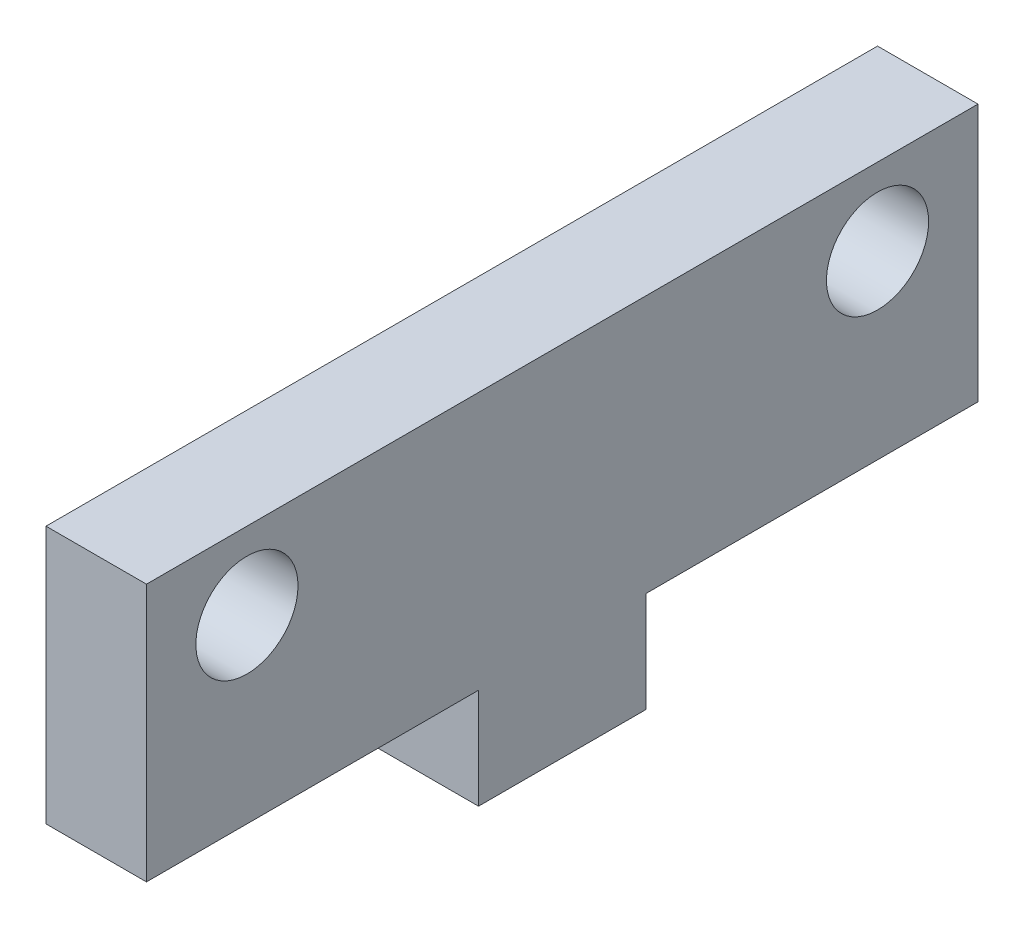
ISO-10303-21;
HEADER;
FILE_DESCRIPTION(('STEP AP214'),'2;1');
FILE_NAME('part.step','',(''),(''),'','','');
FILE_SCHEMA(('AUTOMOTIVE_DESIGN { 1 0 10303 214 1 1 1 1 }'));
ENDSEC;
DATA;
#1=APPLICATION_CONTEXT('core data for automotive mechanical design processes');
#2=APPLICATION_PROTOCOL_DEFINITION('international standard','automotive_design',2000,#1);
#3=PRODUCT_CONTEXT('',#1,'mechanical');
#4=PRODUCT('Part','Part','',(#3));
#5=PRODUCT_RELATED_PRODUCT_CATEGORY('part','',(#4));
#6=PRODUCT_DEFINITION_FORMATION('','',#4);
#7=PRODUCT_DEFINITION_CONTEXT('part definition',#1,'design');
#8=PRODUCT_DEFINITION('design','',#6,#7);
#9=PRODUCT_DEFINITION_SHAPE('','',#8);
#10=(LENGTH_UNIT() NAMED_UNIT(*) SI_UNIT(.MILLI.,.METRE.));
#11=(NAMED_UNIT(*) PLANE_ANGLE_UNIT() SI_UNIT($,.RADIAN.));
#12=(NAMED_UNIT(*) SI_UNIT($,.STERADIAN.) SOLID_ANGLE_UNIT());
#13=UNCERTAINTY_MEASURE_WITH_UNIT(LENGTH_MEASURE(1.E-05),#10,'distance_accuracy_value','');
#14=(GEOMETRIC_REPRESENTATION_CONTEXT(3) GLOBAL_UNCERTAINTY_ASSIGNED_CONTEXT((#13)) GLOBAL_UNIT_ASSIGNED_CONTEXT((#10,
#11,#12)) REPRESENTATION_CONTEXT('',''));
#15=CARTESIAN_POINT('',(0.,0.,0.));
#16=DIRECTION('',(0.,0.,1.));
#17=DIRECTION('',(1.,0.,0.));
#18=AXIS2_PLACEMENT_3D('',#15,#16,#17);
#19=CARTESIAN_POINT('',(3.,0.,0.));
#20=DIRECTION('',(-1.,0.,0.));
#21=DIRECTION('',(0.,0.,1.));
#22=AXIS2_PLACEMENT_3D('',#19,#20,#21);
#23=PLANE('',#22);
#24=DIRECTION('',(0.,1.,0.));
#25=VECTOR('',#24,1.);
#26=CARTESIAN_POINT('',(3.,7.7,0.));
#27=LINE('',#26,#25);
#28=CARTESIAN_POINT('',(3.,0.,0.));
#29=VERTEX_POINT('',#28);
#30=CARTESIAN_POINT('',(3.,7.7,0.));
#31=VERTEX_POINT('',#30);
#32=EDGE_CURVE('E145',#29,#31,#27,.T.);
#33=ORIENTED_EDGE('',*,*,#32,.T.);
#34=DIRECTION('',(0.,0.,1.));
#35=VECTOR('',#34,1.);
#36=CARTESIAN_POINT('',(3.,7.7,24.83));
#37=LINE('',#36,#35);
#38=CARTESIAN_POINT('',(3.,7.7,24.83));
#39=VERTEX_POINT('',#38);
#40=EDGE_CURVE('E93',#31,#39,#37,.T.);
#41=ORIENTED_EDGE('',*,*,#40,.T.);
#42=DIRECTION('',(0.,-1.,0.));
#43=VECTOR('',#42,1.);
#44=CARTESIAN_POINT('',(3.,0.,24.83));
#45=LINE('',#44,#43);
#46=CARTESIAN_POINT('',(3.,0.,24.83));
#47=VERTEX_POINT('',#46);
#48=EDGE_CURVE('E160',#39,#47,#45,.T.);
#49=ORIENTED_EDGE('',*,*,#48,.T.);
#50=DIRECTION('',(0.,0.,-1.));
#51=VECTOR('',#50,1.);
#52=CARTESIAN_POINT('',(3.,0.,14.915));
#53=LINE('',#52,#51);
#54=CARTESIAN_POINT('',(3.,0.,14.915));
#55=VERTEX_POINT('',#54);
#56=EDGE_CURVE('E173',#47,#55,#53,.T.);
#57=ORIENTED_EDGE('',*,*,#56,.T.);
#58=DIRECTION('',(0.,-1.,0.));
#59=VECTOR('',#58,1.);
#60=CARTESIAN_POINT('',(3.,0.,14.915));
#61=LINE('',#60,#59);
#62=CARTESIAN_POINT('',(3.,-3.,14.915));
#63=VERTEX_POINT('',#62);
#64=EDGE_CURVE('E112',#55,#63,#61,.T.);
#65=ORIENTED_EDGE('',*,*,#64,.T.);
#66=DIRECTION('',(0.,0.,-1.));
#67=VECTOR('',#66,1.);
#68=CARTESIAN_POINT('',(3.,-3.,14.915));
#69=LINE('',#68,#67);
#70=CARTESIAN_POINT('',(3.,-3.,9.915));
#71=VERTEX_POINT('',#70);
#72=EDGE_CURVE('E106',#63,#71,#69,.T.);
#73=ORIENTED_EDGE('',*,*,#72,.T.);
#74=DIRECTION('',(0.,1.,0.));
#75=VECTOR('',#74,1.);
#76=CARTESIAN_POINT('',(3.,-3.,9.915));
#77=LINE('',#76,#75);
#78=CARTESIAN_POINT('',(3.,0.,9.915));
#79=VERTEX_POINT('',#78);
#80=EDGE_CURVE('E110',#71,#79,#77,.T.);
#81=ORIENTED_EDGE('',*,*,#80,.T.);
#82=DIRECTION('',(0.,0.,-1.));
#83=VECTOR('',#82,1.);
#84=CARTESIAN_POINT('',(3.,0.,0.));
#85=LINE('',#84,#83);
#86=EDGE_CURVE('E50',#79,#29,#85,.T.);
#87=ORIENTED_EDGE('',*,*,#86,.T.);
#88=EDGE_LOOP('',(#33,#41,#49,#57,#65,#73,#81,#87));
#89=FACE_BOUND('',#88,.T.);
#90=CARTESIAN_POINT('',(3.,5.4,21.83));
#91=DIRECTION('',(1.,0.,0.));
#92=DIRECTION('',(0.,0.,-1.));
#93=AXIS2_PLACEMENT_3D('',#90,#91,#92);
#94=CIRCLE('',#93,1.525);
#95=CARTESIAN_POINT('',(3.,5.4,20.305));
#96=VERTEX_POINT('',#95);
#97=EDGE_CURVE('E134',#96,#96,#94,.T.);
#98=ORIENTED_EDGE('',*,*,#97,.F.);
#99=EDGE_LOOP('',(#98));
#100=FACE_BOUND('',#99,.T.);
#101=CARTESIAN_POINT('',(3.,5.39999999999999,3.));
#102=DIRECTION('',(1.,0.,0.));
#103=DIRECTION('',(0.,0.,-1.));
#104=AXIS2_PLACEMENT_3D('',#101,#102,#103);
#105=CIRCLE('',#104,1.525);
#106=CARTESIAN_POINT('',(3.,5.39999999999999,1.475));
#107=VERTEX_POINT('',#106);
#108=EDGE_CURVE('E182',#107,#107,#105,.T.);
#109=ORIENTED_EDGE('',*,*,#108,.F.);
#110=EDGE_LOOP('',(#109));
#111=FACE_BOUND('',#110,.T.);
#112=ADVANCED_FACE('F33',(#89,#100,#111),#23,.F.);
#113=CARTESIAN_POINT('',(0.,0.,0.));
#114=DIRECTION('',(-1.,0.,0.));
#115=DIRECTION('',(0.,0.,1.));
#116=AXIS2_PLACEMENT_3D('',#113,#114,#115);
#117=PLANE('',#116);
#118=CARTESIAN_POINT('',(0.,5.4,21.83));
#119=DIRECTION('',(1.,0.,0.));
#120=DIRECTION('',(0.,0.,-1.));
#121=AXIS2_PLACEMENT_3D('',#118,#119,#120);
#122=CIRCLE('',#121,1.525);
#123=CARTESIAN_POINT('',(0.,5.4,20.305));
#124=VERTEX_POINT('',#123);
#125=EDGE_CURVE('E179',#124,#124,#122,.T.);
#126=ORIENTED_EDGE('',*,*,#125,.T.);
#127=EDGE_LOOP('',(#126));
#128=FACE_BOUND('',#127,.T.);
#129=DIRECTION('',(0.,1.,0.));
#130=VECTOR('',#129,1.);
#131=CARTESIAN_POINT('',(0.,7.7,0.));
#132=LINE('',#131,#130);
#133=CARTESIAN_POINT('',(0.,0.,0.));
#134=VERTEX_POINT('',#133);
#135=CARTESIAN_POINT('',(0.,7.7,0.));
#136=VERTEX_POINT('',#135);
#137=EDGE_CURVE('E130',#134,#136,#132,.T.);
#138=ORIENTED_EDGE('',*,*,#137,.F.);
#139=DIRECTION('',(0.,0.,-1.));
#140=VECTOR('',#139,1.);
#141=CARTESIAN_POINT('',(0.,0.,0.));
#142=LINE('',#141,#140);
#143=CARTESIAN_POINT('',(0.,0.,9.915));
#144=VERTEX_POINT('',#143);
#145=EDGE_CURVE('E85',#144,#134,#142,.T.);
#146=ORIENTED_EDGE('',*,*,#145,.F.);
#147=DIRECTION('',(0.,1.,0.));
#148=VECTOR('',#147,1.);
#149=CARTESIAN_POINT('',(0.,-3.,9.915));
#150=LINE('',#149,#148);
#151=CARTESIAN_POINT('',(0.,-3.,9.915));
#152=VERTEX_POINT('',#151);
#153=EDGE_CURVE('E79',#152,#144,#150,.T.);
#154=ORIENTED_EDGE('',*,*,#153,.F.);
#155=DIRECTION('',(0.,0.,-1.));
#156=VECTOR('',#155,1.);
#157=CARTESIAN_POINT('',(0.,-3.,14.915));
#158=LINE('',#157,#156);
#159=CARTESIAN_POINT('',(0.,-3.,14.915));
#160=VERTEX_POINT('',#159);
#161=EDGE_CURVE('E120',#160,#152,#158,.T.);
#162=ORIENTED_EDGE('',*,*,#161,.F.);
#163=DIRECTION('',(0.,-1.,0.));
#164=VECTOR('',#163,1.);
#165=CARTESIAN_POINT('',(0.,0.,14.915));
#166=LINE('',#165,#164);
#167=CARTESIAN_POINT('',(0.,0.,14.915));
#168=VERTEX_POINT('',#167);
#169=EDGE_CURVE('E140',#168,#160,#166,.T.);
#170=ORIENTED_EDGE('',*,*,#169,.F.);
#171=DIRECTION('',(0.,0.,-1.));
#172=VECTOR('',#171,1.);
#173=CARTESIAN_POINT('',(0.,0.,14.915));
#174=LINE('',#173,#172);
#175=CARTESIAN_POINT('',(0.,0.,24.83));
#176=VERTEX_POINT('',#175);
#177=EDGE_CURVE('E138',#176,#168,#174,.T.);
#178=ORIENTED_EDGE('',*,*,#177,.F.);
#179=DIRECTION('',(0.,-1.,0.));
#180=VECTOR('',#179,1.);
#181=CARTESIAN_POINT('',(0.,0.,24.83));
#182=LINE('',#181,#180);
#183=CARTESIAN_POINT('',(0.,7.7,24.83));
#184=VERTEX_POINT('',#183);
#185=EDGE_CURVE('E136',#184,#176,#182,.T.);
#186=ORIENTED_EDGE('',*,*,#185,.F.);
#187=DIRECTION('',(0.,0.,1.));
#188=VECTOR('',#187,1.);
#189=CARTESIAN_POINT('',(0.,7.7,24.83));
#190=LINE('',#189,#188);
#191=EDGE_CURVE('E133',#136,#184,#190,.T.);
#192=ORIENTED_EDGE('',*,*,#191,.F.);
#193=EDGE_LOOP('',(#138,#146,#154,#162,#170,#178,#186,#192));
#194=FACE_BOUND('',#193,.T.);
#195=CARTESIAN_POINT('',(0.,5.39999999999999,3.));
#196=DIRECTION('',(1.,0.,0.));
#197=DIRECTION('',(0.,0.,-1.));
#198=AXIS2_PLACEMENT_3D('',#195,#196,#197);
#199=CIRCLE('',#198,1.525);
#200=CARTESIAN_POINT('',(0.,5.39999999999999,1.475));
#201=VERTEX_POINT('',#200);
#202=EDGE_CURVE('E185',#201,#201,#199,.T.);
#203=ORIENTED_EDGE('',*,*,#202,.T.);
#204=EDGE_LOOP('',(#203));
#205=FACE_BOUND('',#204,.T.);
#206=ADVANCED_FACE('F164',(#128,#194,#205),#117,.T.);
#207=CARTESIAN_POINT('',(3.,7.7,0.));
#208=DIRECTION('',(0.,0.,1.));
#209=DIRECTION('',(0.,-1.,0.));
#210=AXIS2_PLACEMENT_3D('',#207,#208,#209);
#211=PLANE('',#210);
#212=ORIENTED_EDGE('',*,*,#137,.T.);
#213=DIRECTION('',(-1.,0.,0.));
#214=VECTOR('',#213,1.);
#215=CARTESIAN_POINT('',(3.,7.7,0.));
#216=LINE('',#215,#214);
#217=EDGE_CURVE('E11',#31,#136,#216,.T.);
#218=ORIENTED_EDGE('',*,*,#217,.F.);
#219=ORIENTED_EDGE('',*,*,#32,.F.);
#220=DIRECTION('',(-1.,0.,0.));
#221=VECTOR('',#220,1.);
#222=CARTESIAN_POINT('',(3.,0.,0.));
#223=LINE('',#222,#221);
#224=EDGE_CURVE('E126',#29,#134,#223,.T.);
#225=ORIENTED_EDGE('',*,*,#224,.T.);
#226=EDGE_LOOP('',(#212,#218,#219,#225));
#227=FACE_BOUND('',#226,.T.);
#228=ADVANCED_FACE('F35',(#227),#211,.F.);
#229=CARTESIAN_POINT('',(3.,7.7,24.83));
#230=DIRECTION('',(0.,-1.,0.));
#231=DIRECTION('',(0.,0.,-1.));
#232=AXIS2_PLACEMENT_3D('',#229,#230,#231);
#233=PLANE('',#232);
#234=ORIENTED_EDGE('',*,*,#191,.T.);
#235=DIRECTION('',(-1.,0.,0.));
#236=VECTOR('',#235,1.);
#237=CARTESIAN_POINT('',(3.,7.7,24.83));
#238=LINE('',#237,#236);
#239=EDGE_CURVE('E42',#39,#184,#238,.T.);
#240=ORIENTED_EDGE('',*,*,#239,.F.);
#241=ORIENTED_EDGE('',*,*,#40,.F.);
#242=ORIENTED_EDGE('',*,*,#217,.T.);
#243=EDGE_LOOP('',(#234,#240,#241,#242));
#244=FACE_BOUND('',#243,.T.);
#245=ADVANCED_FACE('F217',(#244),#233,.F.);
#246=CARTESIAN_POINT('',(3.,0.,24.83));
#247=DIRECTION('',(0.,0.,-1.));
#248=DIRECTION('',(-1.,0.,0.));
#249=AXIS2_PLACEMENT_3D('',#246,#247,#248);
#250=PLANE('',#249);
#251=ORIENTED_EDGE('',*,*,#185,.T.);
#252=DIRECTION('',(-1.,0.,0.));
#253=VECTOR('',#252,1.);
#254=CARTESIAN_POINT('',(3.,0.,24.83));
#255=LINE('',#254,#253);
#256=EDGE_CURVE('E152',#47,#176,#255,.T.);
#257=ORIENTED_EDGE('',*,*,#256,.F.);
#258=ORIENTED_EDGE('',*,*,#48,.F.);
#259=ORIENTED_EDGE('',*,*,#239,.T.);
#260=EDGE_LOOP('',(#251,#257,#258,#259));
#261=FACE_BOUND('',#260,.T.);
#262=ADVANCED_FACE('F158',(#261),#250,.F.);
#263=CARTESIAN_POINT('',(3.,0.,14.915));
#264=DIRECTION('',(0.,1.,0.));
#265=DIRECTION('',(0.,0.,1.));
#266=AXIS2_PLACEMENT_3D('',#263,#264,#265);
#267=PLANE('',#266);
#268=ORIENTED_EDGE('',*,*,#177,.T.);
#269=DIRECTION('',(-1.,0.,0.));
#270=VECTOR('',#269,1.);
#271=CARTESIAN_POINT('',(3.,0.,14.915));
#272=LINE('',#271,#270);
#273=EDGE_CURVE('E149',#55,#168,#272,.T.);
#274=ORIENTED_EDGE('',*,*,#273,.F.);
#275=ORIENTED_EDGE('',*,*,#56,.F.);
#276=ORIENTED_EDGE('',*,*,#256,.T.);
#277=EDGE_LOOP('',(#268,#274,#275,#276));
#278=FACE_BOUND('',#277,.T.);
#279=ADVANCED_FACE('F169',(#278),#267,.F.);
#280=CARTESIAN_POINT('',(3.,0.,14.915));
#281=DIRECTION('',(0.,0.,-1.));
#282=DIRECTION('',(-1.,0.,0.));
#283=AXIS2_PLACEMENT_3D('',#280,#281,#282);
#284=PLANE('',#283);
#285=ORIENTED_EDGE('',*,*,#169,.T.);
#286=DIRECTION('',(-1.,0.,0.));
#287=VECTOR('',#286,1.);
#288=CARTESIAN_POINT('',(3.,-3.,14.915));
#289=LINE('',#288,#287);
#290=EDGE_CURVE('E121',#63,#160,#289,.T.);
#291=ORIENTED_EDGE('',*,*,#290,.F.);
#292=ORIENTED_EDGE('',*,*,#64,.F.);
#293=ORIENTED_EDGE('',*,*,#273,.T.);
#294=EDGE_LOOP('',(#285,#291,#292,#293));
#295=FACE_BOUND('',#294,.T.);
#296=ADVANCED_FACE('F172',(#295),#284,.F.);
#297=CARTESIAN_POINT('',(3.,-3.,14.915));
#298=DIRECTION('',(0.,1.,0.));
#299=DIRECTION('',(0.,0.,1.));
#300=AXIS2_PLACEMENT_3D('',#297,#298,#299);
#301=PLANE('',#300);
#302=ORIENTED_EDGE('',*,*,#161,.T.);
#303=DIRECTION('',(-1.,0.,0.));
#304=VECTOR('',#303,1.);
#305=CARTESIAN_POINT('',(3.,-3.,9.915));
#306=LINE('',#305,#304);
#307=EDGE_CURVE('E117',#71,#152,#306,.T.);
#308=ORIENTED_EDGE('',*,*,#307,.F.);
#309=ORIENTED_EDGE('',*,*,#72,.F.);
#310=ORIENTED_EDGE('',*,*,#290,.T.);
#311=EDGE_LOOP('',(#302,#308,#309,#310));
#312=FACE_BOUND('',#311,.T.);
#313=ADVANCED_FACE('F118',(#312),#301,.F.);
#314=CARTESIAN_POINT('',(3.,-3.,9.915));
#315=DIRECTION('',(0.,0.,1.));
#316=DIRECTION('',(1.,0.,0.));
#317=AXIS2_PLACEMENT_3D('',#314,#315,#316);
#318=PLANE('',#317);
#319=ORIENTED_EDGE('',*,*,#153,.T.);
#320=DIRECTION('',(-1.,0.,0.));
#321=VECTOR('',#320,1.);
#322=CARTESIAN_POINT('',(3.,0.,9.915));
#323=LINE('',#322,#321);
#324=EDGE_CURVE('E122',#79,#144,#323,.T.);
#325=ORIENTED_EDGE('',*,*,#324,.F.);
#326=ORIENTED_EDGE('',*,*,#80,.F.);
#327=ORIENTED_EDGE('',*,*,#307,.T.);
#328=EDGE_LOOP('',(#319,#325,#326,#327));
#329=FACE_BOUND('',#328,.T.);
#330=ADVANCED_FACE('F124',(#329),#318,.F.);
#331=CARTESIAN_POINT('',(3.,0.,0.));
#332=DIRECTION('',(0.,1.,0.));
#333=DIRECTION('',(0.,0.,1.));
#334=AXIS2_PLACEMENT_3D('',#331,#332,#333);
#335=PLANE('',#334);
#336=ORIENTED_EDGE('',*,*,#145,.T.);
#337=ORIENTED_EDGE('',*,*,#224,.F.);
#338=ORIENTED_EDGE('',*,*,#86,.F.);
#339=ORIENTED_EDGE('',*,*,#324,.T.);
#340=EDGE_LOOP('',(#336,#337,#338,#339));
#341=FACE_BOUND('',#340,.T.);
#342=ADVANCED_FACE('F205',(#341),#335,.F.);
#343=CARTESIAN_POINT('',(3.,5.4,21.83));
#344=DIRECTION('',(-1.,0.,0.));
#345=DIRECTION('',(0.,0.,1.));
#346=AXIS2_PLACEMENT_3D('',#343,#344,#345);
#347=CYLINDRICAL_SURFACE('',#346,1.525);
#348=ORIENTED_EDGE('',*,*,#97,.T.);
#349=EDGE_LOOP('',(#348));
#350=FACE_BOUND('',#349,.T.);
#351=ORIENTED_EDGE('',*,*,#125,.F.);
#352=EDGE_LOOP('',(#351));
#353=FACE_BOUND('',#352,.T.);
#354=ADVANCED_FACE('F202',(#350,#353),#347,.F.);
#355=CARTESIAN_POINT('',(3.,5.39999999999999,3.));
#356=DIRECTION('',(-1.,0.,0.));
#357=DIRECTION('',(0.,0.,1.));
#358=AXIS2_PLACEMENT_3D('',#355,#356,#357);
#359=CYLINDRICAL_SURFACE('',#358,1.525);
#360=ORIENTED_EDGE('',*,*,#108,.T.);
#361=EDGE_LOOP('',(#360));
#362=FACE_BOUND('',#361,.T.);
#363=ORIENTED_EDGE('',*,*,#202,.F.);
#364=EDGE_LOOP('',(#363));
#365=FACE_BOUND('',#364,.T.);
#366=ADVANCED_FACE('F191',(#362,#365),#359,.F.);
#367=CLOSED_SHELL('',(#112,#206,#228,#245,#262,#279,#296,#313,#330,#342,#354,#366));
#368=MANIFOLD_SOLID_BREP('B2',#367);
#369=ADVANCED_BREP_SHAPE_REPRESENTATION('',(#18,#368),#14);
#370=SHAPE_DEFINITION_REPRESENTATION(#9,#369);
ENDSEC;
END-ISO-10303-21;
